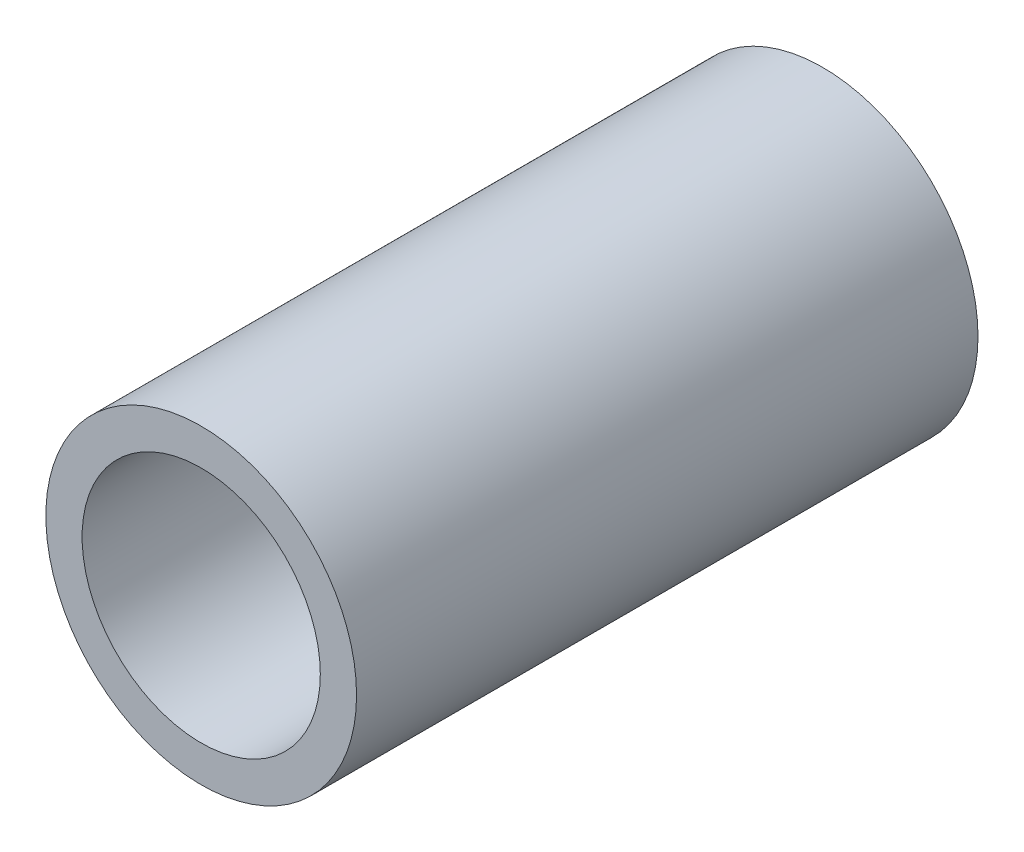
ISO-10303-21;
HEADER;
FILE_DESCRIPTION(('STEP AP214'),'2;1');
FILE_NAME('part.step','',(''),(''),'','','');
FILE_SCHEMA(('AUTOMOTIVE_DESIGN { 1 0 10303 214 1 1 1 1 }'));
ENDSEC;
DATA;
#1=APPLICATION_CONTEXT('core data for automotive mechanical design processes');
#2=APPLICATION_PROTOCOL_DEFINITION('international standard','automotive_design',2000,#1);
#3=PRODUCT_CONTEXT('',#1,'mechanical');
#4=PRODUCT('Part','Part','',(#3));
#5=PRODUCT_RELATED_PRODUCT_CATEGORY('part','',(#4));
#6=PRODUCT_DEFINITION_FORMATION('','',#4);
#7=PRODUCT_DEFINITION_CONTEXT('part definition',#1,'design');
#8=PRODUCT_DEFINITION('design','',#6,#7);
#9=PRODUCT_DEFINITION_SHAPE('','',#8);
#10=(LENGTH_UNIT() NAMED_UNIT(*) SI_UNIT(.MILLI.,.METRE.));
#11=(NAMED_UNIT(*) PLANE_ANGLE_UNIT() SI_UNIT($,.RADIAN.));
#12=(NAMED_UNIT(*) SI_UNIT($,.STERADIAN.) SOLID_ANGLE_UNIT());
#13=UNCERTAINTY_MEASURE_WITH_UNIT(LENGTH_MEASURE(1.E-05),#10,'distance_accuracy_value','');
#14=(GEOMETRIC_REPRESENTATION_CONTEXT(3) GLOBAL_UNCERTAINTY_ASSIGNED_CONTEXT((#13)) GLOBAL_UNIT_ASSIGNED_CONTEXT((#10,
#11,#12)) REPRESENTATION_CONTEXT('',''));
#15=CARTESIAN_POINT('',(0.,0.,0.));
#16=DIRECTION('',(0.,0.,1.));
#17=DIRECTION('',(1.,0.,0.));
#18=AXIS2_PLACEMENT_3D('',#15,#16,#17);
#19=CARTESIAN_POINT('',(0.,0.,12.));
#20=DIRECTION('',(0.,0.,-1.));
#21=DIRECTION('',(-1.,0.,0.));
#22=AXIS2_PLACEMENT_3D('',#19,#20,#21);
#23=CYLINDRICAL_SURFACE('',#22,3.);
#24=CARTESIAN_POINT('',(0.,0.,12.));
#25=DIRECTION('',(0.,0.,1.));
#26=DIRECTION('',(1.,0.,0.));
#27=AXIS2_PLACEMENT_3D('',#24,#25,#26);
#28=CIRCLE('',#27,3.);
#29=CARTESIAN_POINT('',(3.,0.,12.));
#30=VERTEX_POINT('',#29);
#31=EDGE_CURVE('E10',#30,#30,#28,.T.);
#32=ORIENTED_EDGE('',*,*,#31,.F.);
#33=EDGE_LOOP('',(#32));
#34=FACE_BOUND('',#33,.T.);
#35=CARTESIAN_POINT('',(0.,0.,0.));
#36=DIRECTION('',(0.,0.,1.));
#37=DIRECTION('',(1.,0.,0.));
#38=AXIS2_PLACEMENT_3D('',#35,#36,#37);
#39=CIRCLE('',#38,3.);
#40=CARTESIAN_POINT('',(3.,0.,0.));
#41=VERTEX_POINT('',#40);
#42=EDGE_CURVE('E36',#41,#41,#39,.T.);
#43=ORIENTED_EDGE('',*,*,#42,.T.);
#44=EDGE_LOOP('',(#43));
#45=FACE_BOUND('',#44,.T.);
#46=ADVANCED_FACE('F33',(#34,#45),#23,.T.);
#47=CARTESIAN_POINT('',(0.,0.,12.));
#48=DIRECTION('',(0.,0.,1.));
#49=DIRECTION('',(1.,0.,0.));
#50=AXIS2_PLACEMENT_3D('',#47,#48,#49);
#51=PLANE('',#50);
#52=CARTESIAN_POINT('',(0.,0.,12.));
#53=DIRECTION('',(0.,0.,1.));
#54=DIRECTION('',(1.,0.,0.));
#55=AXIS2_PLACEMENT_3D('',#52,#53,#54);
#56=CIRCLE('',#55,2.3);
#57=CARTESIAN_POINT('',(2.3,0.,12.));
#58=VERTEX_POINT('',#57);
#59=EDGE_CURVE('E45',#58,#58,#56,.T.);
#60=ORIENTED_EDGE('',*,*,#59,.F.);
#61=EDGE_LOOP('',(#60));
#62=FACE_BOUND('',#61,.T.);
#63=ORIENTED_EDGE('',*,*,#31,.T.);
#64=EDGE_LOOP('',(#63));
#65=FACE_BOUND('',#64,.T.);
#66=ADVANCED_FACE('F73',(#62,#65),#51,.T.);
#67=CARTESIAN_POINT('',(0.,0.,0.));
#68=DIRECTION('',(0.,0.,1.));
#69=DIRECTION('',(1.,0.,0.));
#70=AXIS2_PLACEMENT_3D('',#67,#68,#69);
#71=PLANE('',#70);
#72=CARTESIAN_POINT('',(0.,0.,0.));
#73=DIRECTION('',(0.,0.,1.));
#74=DIRECTION('',(1.,0.,0.));
#75=AXIS2_PLACEMENT_3D('',#72,#73,#74);
#76=CIRCLE('',#75,2.);
#77=CARTESIAN_POINT('',(2.,0.,0.));
#78=VERTEX_POINT('',#77);
#79=EDGE_CURVE('E48',#78,#78,#76,.F.);
#80=ORIENTED_EDGE('',*,*,#79,.F.);
#81=EDGE_LOOP('',(#80));
#82=FACE_BOUND('',#81,.T.);
#83=ORIENTED_EDGE('',*,*,#42,.F.);
#84=EDGE_LOOP('',(#83));
#85=FACE_BOUND('',#84,.T.);
#86=ADVANCED_FACE('F69',(#82,#85),#71,.F.);
#87=CARTESIAN_POINT('',(0.,0.,3.5));
#88=DIRECTION('',(0.,0.,1.));
#89=DIRECTION('',(1.,0.,0.));
#90=AXIS2_PLACEMENT_3D('',#87,#88,#89);
#91=CYLINDRICAL_SURFACE('',#90,2.3);
#92=CARTESIAN_POINT('',(0.,0.,3.5));
#93=DIRECTION('',(0.,0.,1.));
#94=DIRECTION('',(1.,0.,0.));
#95=AXIS2_PLACEMENT_3D('',#92,#93,#94);
#96=CIRCLE('',#95,2.3);
#97=CARTESIAN_POINT('',(2.3,0.,3.5));
#98=VERTEX_POINT('',#97);
#99=EDGE_CURVE('E43',#98,#98,#96,.T.);
#100=ORIENTED_EDGE('',*,*,#99,.F.);
#101=EDGE_LOOP('',(#100));
#102=FACE_BOUND('',#101,.T.);
#103=ORIENTED_EDGE('',*,*,#59,.T.);
#104=EDGE_LOOP('',(#103));
#105=FACE_BOUND('',#104,.T.);
#106=ADVANCED_FACE('F63',(#102,#105),#91,.F.);
#107=CARTESIAN_POINT('',(0.,0.,3.5));
#108=DIRECTION('',(0.,0.,1.));
#109=DIRECTION('',(1.,0.,0.));
#110=AXIS2_PLACEMENT_3D('',#107,#108,#109);
#111=PLANE('',#110);
#112=CARTESIAN_POINT('',(0.,0.,3.5));
#113=DIRECTION('',(0.,0.,1.));
#114=DIRECTION('',(1.,0.,0.));
#115=AXIS2_PLACEMENT_3D('',#112,#113,#114);
#116=CIRCLE('',#115,2.);
#117=CARTESIAN_POINT('',(2.,0.,3.5));
#118=VERTEX_POINT('',#117);
#119=EDGE_CURVE('E53',#118,#118,#116,.T.);
#120=ORIENTED_EDGE('',*,*,#119,.F.);
#121=EDGE_LOOP('',(#120));
#122=FACE_BOUND('',#121,.T.);
#123=ORIENTED_EDGE('',*,*,#99,.T.);
#124=EDGE_LOOP('',(#123));
#125=FACE_BOUND('',#124,.T.);
#126=ADVANCED_FACE('F60',(#122,#125),#111,.T.);
#127=CARTESIAN_POINT('',(0.,0.,-0.00100000000000013));
#128=DIRECTION('',(0.,0.,1.));
#129=DIRECTION('',(1.,0.,0.));
#130=AXIS2_PLACEMENT_3D('',#127,#128,#129);
#131=CYLINDRICAL_SURFACE('',#130,2.);
#132=ORIENTED_EDGE('',*,*,#119,.T.);
#133=EDGE_LOOP('',(#132));
#134=FACE_BOUND('',#133,.T.);
#135=ORIENTED_EDGE('',*,*,#79,.T.);
#136=EDGE_LOOP('',(#135));
#137=FACE_BOUND('',#136,.T.);
#138=ADVANCED_FACE('F57',(#134,#137),#131,.F.);
#139=CLOSED_SHELL('',(#46,#66,#86,#106,#126,#138));
#140=MANIFOLD_SOLID_BREP('B2',#139);
#141=ADVANCED_BREP_SHAPE_REPRESENTATION('',(#18,#140),#14);
#142=SHAPE_DEFINITION_REPRESENTATION(#9,#141);
ENDSEC;
END-ISO-10303-21;
